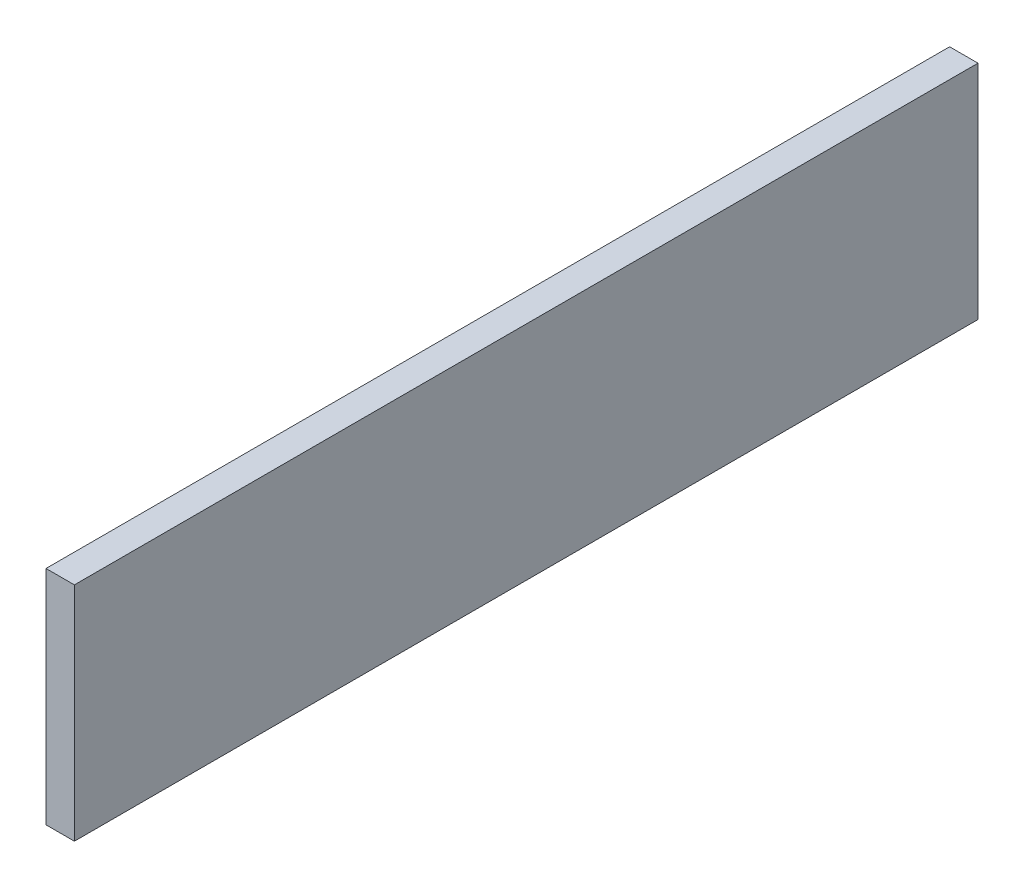
ISO-10303-21;
HEADER;
FILE_DESCRIPTION(('STEP AP214'),'2;1');
FILE_NAME('part.step','',(''),(''),'','','');
FILE_SCHEMA(('AUTOMOTIVE_DESIGN { 1 0 10303 214 1 1 1 1 }'));
ENDSEC;
DATA;
#1=APPLICATION_CONTEXT('core data for automotive mechanical design processes');
#2=APPLICATION_PROTOCOL_DEFINITION('international standard','automotive_design',2000,#1);
#3=PRODUCT_CONTEXT('',#1,'mechanical');
#4=PRODUCT('Part','Part','',(#3));
#5=PRODUCT_RELATED_PRODUCT_CATEGORY('part','',(#4));
#6=PRODUCT_DEFINITION_FORMATION('','',#4);
#7=PRODUCT_DEFINITION_CONTEXT('part definition',#1,'design');
#8=PRODUCT_DEFINITION('design','',#6,#7);
#9=PRODUCT_DEFINITION_SHAPE('','',#8);
#10=(LENGTH_UNIT() NAMED_UNIT(*) SI_UNIT(.MILLI.,.METRE.));
#11=(NAMED_UNIT(*) PLANE_ANGLE_UNIT() SI_UNIT($,.RADIAN.));
#12=(NAMED_UNIT(*) SI_UNIT($,.STERADIAN.) SOLID_ANGLE_UNIT());
#13=UNCERTAINTY_MEASURE_WITH_UNIT(LENGTH_MEASURE(1.E-05),#10,'distance_accuracy_value','');
#14=(GEOMETRIC_REPRESENTATION_CONTEXT(3) GLOBAL_UNCERTAINTY_ASSIGNED_CONTEXT((#13)) GLOBAL_UNIT_ASSIGNED_CONTEXT((#10,
#11,#12)) REPRESENTATION_CONTEXT('',''));
#15=CARTESIAN_POINT('',(0.,0.,0.));
#16=DIRECTION('',(0.,0.,1.));
#17=DIRECTION('',(1.,0.,0.));
#18=AXIS2_PLACEMENT_3D('',#15,#16,#17);
#19=CARTESIAN_POINT('',(0.,-86.,0.));
#20=DIRECTION('',(1.,0.,0.));
#21=DIRECTION('',(0.,0.,-1.));
#22=AXIS2_PLACEMENT_3D('',#19,#20,#21);
#23=PLANE('',#22);
#24=DIRECTION('',(0.,-1.,0.));
#25=VECTOR('',#24,1.);
#26=CARTESIAN_POINT('',(0.,0.,350.));
#27=LINE('',#26,#25);
#28=CARTESIAN_POINT('',(0.,0.,350.));
#29=VERTEX_POINT('',#28);
#30=CARTESIAN_POINT('',(0.,-172.,350.));
#31=VERTEX_POINT('',#30);
#32=EDGE_CURVE('E78',#29,#31,#27,.T.);
#33=ORIENTED_EDGE('',*,*,#32,.F.);
#34=DIRECTION('',(0.,0.,1.));
#35=VECTOR('',#34,1.);
#36=CARTESIAN_POINT('',(0.,0.,-350.));
#37=LINE('',#36,#35);
#38=CARTESIAN_POINT('',(0.,0.,-350.));
#39=VERTEX_POINT('',#38);
#40=EDGE_CURVE('E54',#39,#29,#37,.T.);
#41=ORIENTED_EDGE('',*,*,#40,.F.);
#42=DIRECTION('',(0.,1.,0.));
#43=VECTOR('',#42,1.);
#44=CARTESIAN_POINT('',(0.,-172.,-350.));
#45=LINE('',#44,#43);
#46=CARTESIAN_POINT('',(0.,-172.,-350.));
#47=VERTEX_POINT('',#46);
#48=EDGE_CURVE('E56',#47,#39,#45,.T.);
#49=ORIENTED_EDGE('',*,*,#48,.F.);
#50=DIRECTION('',(0.,0.,-1.));
#51=VECTOR('',#50,1.);
#52=CARTESIAN_POINT('',(0.,-172.,350.));
#53=LINE('',#52,#51);
#54=EDGE_CURVE('E19',#31,#47,#53,.T.);
#55=ORIENTED_EDGE('',*,*,#54,.F.);
#56=EDGE_LOOP('',(#33,#41,#49,#55));
#57=FACE_BOUND('',#56,.T.);
#58=ADVANCED_FACE('F16',(#57),#23,.F.);
#59=CARTESIAN_POINT('',(0.,-172.,350.));
#60=DIRECTION('',(0.,-1.,0.));
#61=DIRECTION('',(0.,0.,-1.));
#62=AXIS2_PLACEMENT_3D('',#59,#60,#61);
#63=PLANE('',#62);
#64=DIRECTION('',(0.,0.,-1.));
#65=VECTOR('',#64,1.);
#66=CARTESIAN_POINT('',(22.,-172.,0.));
#67=LINE('',#66,#65);
#68=CARTESIAN_POINT('',(22.,-172.,350.));
#69=VERTEX_POINT('',#68);
#70=CARTESIAN_POINT('',(22.,-172.,-350.));
#71=VERTEX_POINT('',#70);
#72=EDGE_CURVE('E82',#69,#71,#67,.T.);
#73=ORIENTED_EDGE('',*,*,#72,.F.);
#74=DIRECTION('',(1.,0.,0.));
#75=VECTOR('',#74,1.);
#76=CARTESIAN_POINT('',(0.,-172.,350.));
#77=LINE('',#76,#75);
#78=EDGE_CURVE('E67',#31,#69,#77,.T.);
#79=ORIENTED_EDGE('',*,*,#78,.F.);
#80=ORIENTED_EDGE('',*,*,#54,.T.);
#81=DIRECTION('',(-1.,0.,0.));
#82=VECTOR('',#81,1.);
#83=CARTESIAN_POINT('',(0.,-172.,-350.));
#84=LINE('',#83,#82);
#85=EDGE_CURVE('E62',#71,#47,#84,.T.);
#86=ORIENTED_EDGE('',*,*,#85,.F.);
#87=EDGE_LOOP('',(#73,#79,#80,#86));
#88=FACE_BOUND('',#87,.T.);
#89=ADVANCED_FACE('F64',(#88),#63,.T.);
#90=CARTESIAN_POINT('',(0.,-172.,-350.));
#91=DIRECTION('',(0.,0.,-1.));
#92=DIRECTION('',(-1.,0.,0.));
#93=AXIS2_PLACEMENT_3D('',#90,#91,#92);
#94=PLANE('',#93);
#95=DIRECTION('',(0.,1.,0.));
#96=VECTOR('',#95,1.);
#97=CARTESIAN_POINT('',(22.,-86.,-350.));
#98=LINE('',#97,#96);
#99=CARTESIAN_POINT('',(22.,0.,-350.));
#100=VERTEX_POINT('',#99);
#101=EDGE_CURVE('E71',#71,#100,#98,.T.);
#102=ORIENTED_EDGE('',*,*,#101,.F.);
#103=ORIENTED_EDGE('',*,*,#85,.T.);
#104=ORIENTED_EDGE('',*,*,#48,.T.);
#105=DIRECTION('',(1.,0.,0.));
#106=VECTOR('',#105,1.);
#107=CARTESIAN_POINT('',(0.,0.,-350.));
#108=LINE('',#107,#106);
#109=EDGE_CURVE('E74',#100,#39,#108,.F.);
#110=ORIENTED_EDGE('',*,*,#109,.F.);
#111=EDGE_LOOP('',(#102,#103,#104,#110));
#112=FACE_BOUND('',#111,.T.);
#113=ADVANCED_FACE('F69',(#112),#94,.T.);
#114=CARTESIAN_POINT('',(0.,0.,-350.));
#115=DIRECTION('',(0.,1.,0.));
#116=DIRECTION('',(0.,0.,1.));
#117=AXIS2_PLACEMENT_3D('',#114,#115,#116);
#118=PLANE('',#117);
#119=DIRECTION('',(0.,0.,-1.));
#120=VECTOR('',#119,1.);
#121=CARTESIAN_POINT('',(22.,0.,0.));
#122=LINE('',#121,#120);
#123=CARTESIAN_POINT('',(22.,0.,350.));
#124=VERTEX_POINT('',#123);
#125=EDGE_CURVE('E25',#100,#124,#122,.F.);
#126=ORIENTED_EDGE('',*,*,#125,.F.);
#127=ORIENTED_EDGE('',*,*,#109,.T.);
#128=ORIENTED_EDGE('',*,*,#40,.T.);
#129=DIRECTION('',(1.,0.,0.));
#130=VECTOR('',#129,1.);
#131=CARTESIAN_POINT('',(0.,0.,350.));
#132=LINE('',#131,#130);
#133=EDGE_CURVE('E34',#124,#29,#132,.F.);
#134=ORIENTED_EDGE('',*,*,#133,.F.);
#135=EDGE_LOOP('',(#126,#127,#128,#134));
#136=FACE_BOUND('',#135,.T.);
#137=ADVANCED_FACE('F88',(#136),#118,.T.);
#138=CARTESIAN_POINT('',(0.,0.,350.));
#139=DIRECTION('',(0.,0.,1.));
#140=DIRECTION('',(0.,-1.,0.));
#141=AXIS2_PLACEMENT_3D('',#138,#139,#140);
#142=PLANE('',#141);
#143=DIRECTION('',(0.,1.,0.));
#144=VECTOR('',#143,1.);
#145=CARTESIAN_POINT('',(22.,-86.,350.));
#146=LINE('',#145,#144);
#147=EDGE_CURVE('E11',#124,#69,#146,.F.);
#148=ORIENTED_EDGE('',*,*,#147,.F.);
#149=ORIENTED_EDGE('',*,*,#133,.T.);
#150=ORIENTED_EDGE('',*,*,#32,.T.);
#151=ORIENTED_EDGE('',*,*,#78,.T.);
#152=EDGE_LOOP('',(#148,#149,#150,#151));
#153=FACE_BOUND('',#152,.T.);
#154=ADVANCED_FACE('F90',(#153),#142,.T.);
#155=CARTESIAN_POINT('',(22.,-86.,0.));
#156=DIRECTION('',(1.,0.,0.));
#157=DIRECTION('',(0.,0.,-1.));
#158=AXIS2_PLACEMENT_3D('',#155,#156,#157);
#159=PLANE('',#158);
#160=ORIENTED_EDGE('',*,*,#125,.T.);
#161=ORIENTED_EDGE('',*,*,#147,.T.);
#162=ORIENTED_EDGE('',*,*,#72,.T.);
#163=ORIENTED_EDGE('',*,*,#101,.T.);
#164=EDGE_LOOP('',(#160,#161,#162,#163));
#165=FACE_BOUND('',#164,.T.);
#166=ADVANCED_FACE('F87',(#165),#159,.T.);
#167=CLOSED_SHELL('',(#58,#89,#113,#137,#154,#166));
#168=MANIFOLD_SOLID_BREP('B1',#167);
#169=ADVANCED_BREP_SHAPE_REPRESENTATION('',(#18,#168),#14);
#170=SHAPE_DEFINITION_REPRESENTATION(#9,#169);
ENDSEC;
END-ISO-10303-21;
